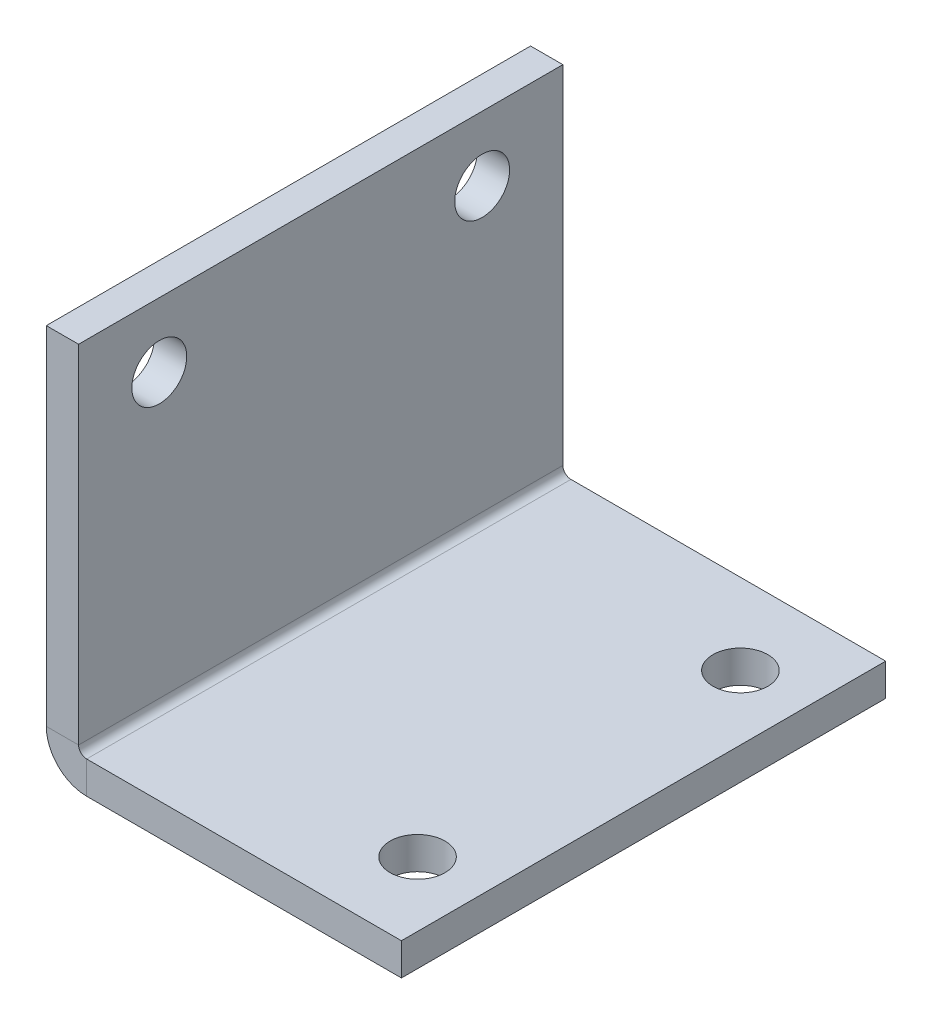
ISO-10303-21;
HEADER;
FILE_DESCRIPTION(('STEP AP214'),'2;1');
FILE_NAME('part.step','',(''),(''),'','','');
FILE_SCHEMA(('AUTOMOTIVE_DESIGN { 1 0 10303 214 1 1 1 1 }'));
ENDSEC;
DATA;
#1=APPLICATION_CONTEXT('core data for automotive mechanical design processes');
#2=APPLICATION_PROTOCOL_DEFINITION('international standard','automotive_design',2000,#1);
#3=PRODUCT_CONTEXT('',#1,'mechanical');
#4=PRODUCT('Part','Part','',(#3));
#5=PRODUCT_RELATED_PRODUCT_CATEGORY('part','',(#4));
#6=PRODUCT_DEFINITION_FORMATION('','',#4);
#7=PRODUCT_DEFINITION_CONTEXT('part definition',#1,'design');
#8=PRODUCT_DEFINITION('design','',#6,#7);
#9=PRODUCT_DEFINITION_SHAPE('','',#8);
#10=(LENGTH_UNIT() NAMED_UNIT(*) SI_UNIT(.MILLI.,.METRE.));
#11=(NAMED_UNIT(*) PLANE_ANGLE_UNIT() SI_UNIT($,.RADIAN.));
#12=(NAMED_UNIT(*) SI_UNIT($,.STERADIAN.) SOLID_ANGLE_UNIT());
#13=UNCERTAINTY_MEASURE_WITH_UNIT(LENGTH_MEASURE(1.E-05),#10,'distance_accuracy_value','');
#14=(GEOMETRIC_REPRESENTATION_CONTEXT(3) GLOBAL_UNCERTAINTY_ASSIGNED_CONTEXT((#13)) GLOBAL_UNIT_ASSIGNED_CONTEXT((#10,
#11,#12)) REPRESENTATION_CONTEXT('',''));
#15=CARTESIAN_POINT('',(0.,0.,0.));
#16=DIRECTION('',(0.,0.,1.));
#17=DIRECTION('',(1.,0.,0.));
#18=AXIS2_PLACEMENT_3D('',#15,#16,#17);
#19=CARTESIAN_POINT('',(0.5,0.,30.));
#20=DIRECTION('',(0.,0.,1.));
#21=DIRECTION('',(1.,0.,0.));
#22=AXIS2_PLACEMENT_3D('',#19,#20,#21);
#23=PLANE('',#22);
#24=DIRECTION('',(0.,-1.,0.));
#25=VECTOR('',#24,1.);
#26=CARTESIAN_POINT('',(0.5,0.,30.));
#27=LINE('',#26,#25);
#28=CARTESIAN_POINT('',(0.5,0.,30.));
#29=VERTEX_POINT('',#28);
#30=CARTESIAN_POINT('',(0.5,-2.,30.));
#31=VERTEX_POINT('',#30);
#32=EDGE_CURVE('E11',#29,#31,#27,.T.);
#33=ORIENTED_EDGE('',*,*,#32,.F.);
#34=CARTESIAN_POINT('',(0.5,0.5,30.));
#35=DIRECTION('',(0.,0.,-1.));
#36=DIRECTION('',(-1.,0.,0.));
#37=AXIS2_PLACEMENT_3D('',#34,#35,#36);
#38=CIRCLE('',#37,0.5);
#39=CARTESIAN_POINT('',(0.,0.5,30.));
#40=VERTEX_POINT('',#39);
#41=EDGE_CURVE('E139',#40,#29,#38,.F.);
#42=ORIENTED_EDGE('',*,*,#41,.F.);
#43=DIRECTION('',(1.,0.,0.));
#44=VECTOR('',#43,1.);
#45=CARTESIAN_POINT('',(-2.,0.5,30.));
#46=LINE('',#45,#44);
#47=CARTESIAN_POINT('',(-2.,0.5,30.));
#48=VERTEX_POINT('',#47);
#49=EDGE_CURVE('E49',#48,#40,#46,.T.);
#50=ORIENTED_EDGE('',*,*,#49,.F.);
#51=CARTESIAN_POINT('',(0.5,0.5,30.));
#52=DIRECTION('',(0.,0.,1.));
#53=DIRECTION('',(1.,0.,0.));
#54=AXIS2_PLACEMENT_3D('',#51,#52,#53);
#55=CIRCLE('',#54,2.5);
#56=EDGE_CURVE('E132',#48,#31,#55,.T.);
#57=ORIENTED_EDGE('',*,*,#56,.T.);
#58=EDGE_LOOP('',(#33,#42,#50,#57));
#59=FACE_BOUND('',#58,.T.);
#60=ADVANCED_FACE('F40',(#59),#23,.T.);
#61=CARTESIAN_POINT('',(-2.,0.5,30.));
#62=DIRECTION('',(0.,0.,1.));
#63=DIRECTION('',(1.,0.,0.));
#64=AXIS2_PLACEMENT_3D('',#61,#62,#63);
#65=PLANE('',#64);
#66=DIRECTION('',(1.,0.,0.));
#67=VECTOR('',#66,1.);
#68=CARTESIAN_POINT('',(0.,0.,30.));
#69=LINE('',#68,#67);
#70=CARTESIAN_POINT('',(20.,0.,30.));
#71=VERTEX_POINT('',#70);
#72=EDGE_CURVE('E200',#29,#71,#69,.T.);
#73=ORIENTED_EDGE('',*,*,#72,.F.);
#74=ORIENTED_EDGE('',*,*,#32,.T.);
#75=DIRECTION('',(1.,0.,0.));
#76=VECTOR('',#75,1.);
#77=CARTESIAN_POINT('',(0.,-2.,30.));
#78=LINE('',#77,#76);
#79=CARTESIAN_POINT('',(20.,-2.,30.));
#80=VERTEX_POINT('',#79);
#81=EDGE_CURVE('E98',#31,#80,#78,.T.);
#82=ORIENTED_EDGE('',*,*,#81,.T.);
#83=DIRECTION('',(0.,-1.,0.));
#84=VECTOR('',#83,1.);
#85=CARTESIAN_POINT('',(20.,0.,30.));
#86=LINE('',#85,#84);
#87=EDGE_CURVE('E197',#71,#80,#86,.T.);
#88=ORIENTED_EDGE('',*,*,#87,.F.);
#89=EDGE_LOOP('',(#73,#74,#82,#88));
#90=FACE_BOUND('',#89,.T.);
#91=ADVANCED_FACE('F220',(#90),#65,.T.);
#92=CARTESIAN_POINT('',(0.,0.5,0.));
#93=DIRECTION('',(0.,0.,-1.));
#94=DIRECTION('',(-1.,0.,0.));
#95=AXIS2_PLACEMENT_3D('',#92,#93,#94);
#96=PLANE('',#95);
#97=DIRECTION('',(-1.,0.,0.));
#98=VECTOR('',#97,1.);
#99=CARTESIAN_POINT('',(0.,0.5,0.));
#100=LINE('',#99,#98);
#101=CARTESIAN_POINT('',(0.,0.5,0.));
#102=VERTEX_POINT('',#101);
#103=CARTESIAN_POINT('',(-2.,0.5,0.));
#104=VERTEX_POINT('',#103);
#105=EDGE_CURVE('E85',#102,#104,#100,.T.);
#106=ORIENTED_EDGE('',*,*,#105,.F.);
#107=CARTESIAN_POINT('',(0.5,0.5,0.));
#108=DIRECTION('',(0.,0.,-1.));
#109=DIRECTION('',(-1.,0.,0.));
#110=AXIS2_PLACEMENT_3D('',#107,#108,#109);
#111=CIRCLE('',#110,0.5);
#112=CARTESIAN_POINT('',(0.5,0.,0.));
#113=VERTEX_POINT('',#112);
#114=EDGE_CURVE('E154',#102,#113,#111,.F.);
#115=ORIENTED_EDGE('',*,*,#114,.T.);
#116=DIRECTION('',(0.,1.,0.));
#117=VECTOR('',#116,1.);
#118=CARTESIAN_POINT('',(0.5,-2.,0.));
#119=LINE('',#118,#117);
#120=CARTESIAN_POINT('',(0.5,-2.,0.));
#121=VERTEX_POINT('',#120);
#122=EDGE_CURVE('E92',#121,#113,#119,.T.);
#123=ORIENTED_EDGE('',*,*,#122,.F.);
#124=CARTESIAN_POINT('',(0.5,0.5,0.));
#125=DIRECTION('',(0.,0.,1.));
#126=DIRECTION('',(1.,0.,0.));
#127=AXIS2_PLACEMENT_3D('',#124,#125,#126);
#128=CIRCLE('',#127,2.5);
#129=EDGE_CURVE('E161',#104,#121,#128,.T.);
#130=ORIENTED_EDGE('',*,*,#129,.F.);
#131=EDGE_LOOP('',(#106,#115,#123,#130));
#132=FACE_BOUND('',#131,.T.);
#133=ADVANCED_FACE('F218',(#132),#96,.T.);
#134=CARTESIAN_POINT('',(0.5,-2.,0.));
#135=DIRECTION('',(0.,0.,-1.));
#136=DIRECTION('',(-1.,0.,0.));
#137=AXIS2_PLACEMENT_3D('',#134,#135,#136);
#138=PLANE('',#137);
#139=DIRECTION('',(0.,-1.,0.));
#140=VECTOR('',#139,1.);
#141=CARTESIAN_POINT('',(0.,0.,0.));
#142=LINE('',#141,#140);
#143=CARTESIAN_POINT('',(0.,22.,0.));
#144=VERTEX_POINT('',#143);
#145=EDGE_CURVE('E156',#144,#102,#142,.T.);
#146=ORIENTED_EDGE('',*,*,#145,.T.);
#147=ORIENTED_EDGE('',*,*,#105,.T.);
#148=DIRECTION('',(0.,1.,0.));
#149=VECTOR('',#148,1.);
#150=CARTESIAN_POINT('',(-2.,0.,0.));
#151=LINE('',#150,#149);
#152=CARTESIAN_POINT('',(-2.,22.,0.));
#153=VERTEX_POINT('',#152);
#154=EDGE_CURVE('E159',#153,#104,#151,.F.);
#155=ORIENTED_EDGE('',*,*,#154,.F.);
#156=DIRECTION('',(1.,0.,0.));
#157=VECTOR('',#156,1.);
#158=CARTESIAN_POINT('',(-2.,22.,0.));
#159=LINE('',#158,#157);
#160=EDGE_CURVE('E120',#153,#144,#159,.T.);
#161=ORIENTED_EDGE('',*,*,#160,.T.);
#162=EDGE_LOOP('',(#146,#147,#155,#161));
#163=FACE_BOUND('',#162,.T.);
#164=ADVANCED_FACE('F214',(#163),#138,.T.);
#165=CARTESIAN_POINT('',(0.,-2.,30.));
#166=DIRECTION('',(0.,1.,0.));
#167=DIRECTION('',(0.,0.,1.));
#168=AXIS2_PLACEMENT_3D('',#165,#166,#167);
#169=PLANE('',#168);
#170=CARTESIAN_POINT('',(16.,-2.,5.));
#171=DIRECTION('',(0.,1.,0.));
#172=DIRECTION('',(0.,0.,1.));
#173=AXIS2_PLACEMENT_3D('',#170,#171,#172);
#174=CIRCLE('',#173,1.7);
#175=CARTESIAN_POINT('',(16.,-2.,6.7));
#176=VERTEX_POINT('',#175);
#177=EDGE_CURVE('E191',#176,#176,#174,.T.);
#178=ORIENTED_EDGE('',*,*,#177,.T.);
#179=EDGE_LOOP('',(#178));
#180=FACE_BOUND('',#179,.T.);
#181=CARTESIAN_POINT('',(16.,-2.,25.));
#182=DIRECTION('',(0.,1.,0.));
#183=DIRECTION('',(0.,0.,1.));
#184=AXIS2_PLACEMENT_3D('',#181,#182,#183);
#185=CIRCLE('',#184,1.7);
#186=CARTESIAN_POINT('',(16.,-2.,26.7));
#187=VERTEX_POINT('',#186);
#188=EDGE_CURVE('E457',#187,#187,#185,.T.);
#189=ORIENTED_EDGE('',*,*,#188,.T.);
#190=EDGE_LOOP('',(#189));
#191=FACE_BOUND('',#190,.T.);
#192=DIRECTION('',(1.,0.,0.));
#193=VECTOR('',#192,1.);
#194=CARTESIAN_POINT('',(0.,-2.,0.));
#195=LINE('',#194,#193);
#196=CARTESIAN_POINT('',(20.,-2.,0.));
#197=VERTEX_POINT('',#196);
#198=EDGE_CURVE('E145',#121,#197,#195,.T.);
#199=ORIENTED_EDGE('',*,*,#198,.T.);
#200=DIRECTION('',(0.,0.,-1.));
#201=VECTOR('',#200,1.);
#202=CARTESIAN_POINT('',(20.,-2.,30.));
#203=LINE('',#202,#201);
#204=EDGE_CURVE('E175',#80,#197,#203,.T.);
#205=ORIENTED_EDGE('',*,*,#204,.F.);
#206=ORIENTED_EDGE('',*,*,#81,.F.);
#207=DIRECTION('',(0.,0.,-1.));
#208=VECTOR('',#207,1.);
#209=CARTESIAN_POINT('',(0.5,-2.,30.));
#210=LINE('',#209,#208);
#211=EDGE_CURVE('E144',#31,#121,#210,.T.);
#212=ORIENTED_EDGE('',*,*,#211,.T.);
#213=EDGE_LOOP('',(#199,#205,#206,#212));
#214=FACE_BOUND('',#213,.T.);
#215=ADVANCED_FACE('F226',(#180,#191,#214),#169,.F.);
#216=CARTESIAN_POINT('',(20.,0.,30.));
#217=DIRECTION('',(1.,0.,0.));
#218=DIRECTION('',(0.,0.,-1.));
#219=AXIS2_PLACEMENT_3D('',#216,#217,#218);
#220=PLANE('',#219);
#221=DIRECTION('',(0.,-1.,0.));
#222=VECTOR('',#221,1.);
#223=CARTESIAN_POINT('',(20.,0.,0.));
#224=LINE('',#223,#222);
#225=CARTESIAN_POINT('',(20.,0.,0.));
#226=VERTEX_POINT('',#225);
#227=EDGE_CURVE('E148',#226,#197,#224,.T.);
#228=ORIENTED_EDGE('',*,*,#227,.F.);
#229=DIRECTION('',(0.,0.,-1.));
#230=VECTOR('',#229,1.);
#231=CARTESIAN_POINT('',(20.,0.,30.));
#232=LINE('',#231,#230);
#233=EDGE_CURVE('E173',#71,#226,#232,.T.);
#234=ORIENTED_EDGE('',*,*,#233,.F.);
#235=ORIENTED_EDGE('',*,*,#87,.T.);
#236=ORIENTED_EDGE('',*,*,#204,.T.);
#237=EDGE_LOOP('',(#228,#234,#235,#236));
#238=FACE_BOUND('',#237,.T.);
#239=ADVANCED_FACE('F255',(#238),#220,.T.);
#240=CARTESIAN_POINT('',(0.,0.,30.));
#241=DIRECTION('',(0.,1.,0.));
#242=DIRECTION('',(0.,0.,1.));
#243=AXIS2_PLACEMENT_3D('',#240,#241,#242);
#244=PLANE('',#243);
#245=CARTESIAN_POINT('',(16.,0.,5.));
#246=DIRECTION('',(0.,1.,0.));
#247=DIRECTION('',(0.,0.,1.));
#248=AXIS2_PLACEMENT_3D('',#245,#246,#247);
#249=CIRCLE('',#248,1.7);
#250=CARTESIAN_POINT('',(16.,0.,6.7));
#251=VERTEX_POINT('',#250);
#252=EDGE_CURVE('E454',#251,#251,#249,.T.);
#253=ORIENTED_EDGE('',*,*,#252,.F.);
#254=EDGE_LOOP('',(#253));
#255=FACE_BOUND('',#254,.T.);
#256=CARTESIAN_POINT('',(16.,0.,25.));
#257=DIRECTION('',(0.,1.,0.));
#258=DIRECTION('',(0.,0.,1.));
#259=AXIS2_PLACEMENT_3D('',#256,#257,#258);
#260=CIRCLE('',#259,1.7);
#261=CARTESIAN_POINT('',(16.,0.,26.7));
#262=VERTEX_POINT('',#261);
#263=EDGE_CURVE('E461',#262,#262,#260,.T.);
#264=ORIENTED_EDGE('',*,*,#263,.F.);
#265=EDGE_LOOP('',(#264));
#266=FACE_BOUND('',#265,.T.);
#267=DIRECTION('',(1.,0.,0.));
#268=VECTOR('',#267,1.);
#269=CARTESIAN_POINT('',(0.,0.,0.));
#270=LINE('',#269,#268);
#271=EDGE_CURVE('E151',#113,#226,#270,.T.);
#272=ORIENTED_EDGE('',*,*,#271,.F.);
#273=DIRECTION('',(0.,0.,-1.));
#274=VECTOR('',#273,1.);
#275=CARTESIAN_POINT('',(0.5,0.,30.));
#276=LINE('',#275,#274);
#277=EDGE_CURVE('E170',#29,#113,#276,.T.);
#278=ORIENTED_EDGE('',*,*,#277,.F.);
#279=ORIENTED_EDGE('',*,*,#72,.T.);
#280=ORIENTED_EDGE('',*,*,#233,.T.);
#281=EDGE_LOOP('',(#272,#278,#279,#280));
#282=FACE_BOUND('',#281,.T.);
#283=ADVANCED_FACE('F260',(#255,#266,#282),#244,.T.);
#284=CARTESIAN_POINT('',(0.5,0.5,30.));
#285=DIRECTION('',(0.,0.,-1.));
#286=DIRECTION('',(-1.,0.,0.));
#287=AXIS2_PLACEMENT_3D('',#284,#285,#286);
#288=CYLINDRICAL_SURFACE('',#287,0.5);
#289=ORIENTED_EDGE('',*,*,#114,.F.);
#290=DIRECTION('',(0.,0.,-1.));
#291=VECTOR('',#290,1.);
#292=CARTESIAN_POINT('',(0.,0.5,30.));
#293=LINE('',#292,#291);
#294=EDGE_CURVE('E167',#40,#102,#293,.T.);
#295=ORIENTED_EDGE('',*,*,#294,.F.);
#296=ORIENTED_EDGE('',*,*,#41,.T.);
#297=ORIENTED_EDGE('',*,*,#277,.T.);
#298=EDGE_LOOP('',(#289,#295,#296,#297));
#299=FACE_BOUND('',#298,.T.);
#300=ADVANCED_FACE('F207',(#299),#288,.F.);
#301=CARTESIAN_POINT('',(0.,0.,30.));
#302=DIRECTION('',(1.,0.,0.));
#303=DIRECTION('',(0.,0.,-1.));
#304=AXIS2_PLACEMENT_3D('',#301,#302,#303);
#305=PLANE('',#304);
#306=CARTESIAN_POINT('',(0.,18.,25.));
#307=DIRECTION('',(1.,0.,0.));
#308=DIRECTION('',(0.,0.,-1.));
#309=AXIS2_PLACEMENT_3D('',#306,#307,#308);
#310=CIRCLE('',#309,1.7);
#311=CARTESIAN_POINT('',(0.,18.,23.3));
#312=VERTEX_POINT('',#311);
#313=EDGE_CURVE('E181',#312,#312,#310,.T.);
#314=ORIENTED_EDGE('',*,*,#313,.F.);
#315=EDGE_LOOP('',(#314));
#316=FACE_BOUND('',#315,.T.);
#317=CARTESIAN_POINT('',(0.,18.,5.));
#318=DIRECTION('',(1.,0.,0.));
#319=DIRECTION('',(0.,0.,-1.));
#320=AXIS2_PLACEMENT_3D('',#317,#318,#319);
#321=CIRCLE('',#320,1.7);
#322=CARTESIAN_POINT('',(0.,18.,3.3));
#323=VERTEX_POINT('',#322);
#324=EDGE_CURVE('E186',#323,#323,#321,.T.);
#325=ORIENTED_EDGE('',*,*,#324,.F.);
#326=EDGE_LOOP('',(#325));
#327=FACE_BOUND('',#326,.T.);
#328=ORIENTED_EDGE('',*,*,#145,.F.);
#329=DIRECTION('',(0.,0.,-1.));
#330=VECTOR('',#329,1.);
#331=CARTESIAN_POINT('',(0.,22.,30.));
#332=LINE('',#331,#330);
#333=CARTESIAN_POINT('',(0.,22.,30.));
#334=VERTEX_POINT('',#333);
#335=EDGE_CURVE('E122',#334,#144,#332,.T.);
#336=ORIENTED_EDGE('',*,*,#335,.F.);
#337=DIRECTION('',(0.,-1.,0.));
#338=VECTOR('',#337,1.);
#339=CARTESIAN_POINT('',(0.,0.,30.));
#340=LINE('',#339,#338);
#341=EDGE_CURVE('E137',#334,#40,#340,.T.);
#342=ORIENTED_EDGE('',*,*,#341,.T.);
#343=ORIENTED_EDGE('',*,*,#294,.T.);
#344=EDGE_LOOP('',(#328,#336,#342,#343));
#345=FACE_BOUND('',#344,.T.);
#346=ADVANCED_FACE('F213',(#316,#327,#345),#305,.T.);
#347=CARTESIAN_POINT('',(-2.,22.,30.));
#348=DIRECTION('',(0.,1.,0.));
#349=DIRECTION('',(0.,0.,1.));
#350=AXIS2_PLACEMENT_3D('',#347,#348,#349);
#351=PLANE('',#350);
#352=ORIENTED_EDGE('',*,*,#160,.F.);
#353=DIRECTION('',(0.,0.,-1.));
#354=VECTOR('',#353,1.);
#355=CARTESIAN_POINT('',(-2.,22.,30.));
#356=LINE('',#355,#354);
#357=CARTESIAN_POINT('',(-2.,22.,30.));
#358=VERTEX_POINT('',#357);
#359=EDGE_CURVE('E114',#358,#153,#356,.T.);
#360=ORIENTED_EDGE('',*,*,#359,.F.);
#361=DIRECTION('',(1.,0.,0.));
#362=VECTOR('',#361,1.);
#363=CARTESIAN_POINT('',(-2.,22.,30.));
#364=LINE('',#363,#362);
#365=EDGE_CURVE('E118',#358,#334,#364,.T.);
#366=ORIENTED_EDGE('',*,*,#365,.T.);
#367=ORIENTED_EDGE('',*,*,#335,.T.);
#368=EDGE_LOOP('',(#352,#360,#366,#367));
#369=FACE_BOUND('',#368,.T.);
#370=ADVANCED_FACE('F116',(#369),#351,.T.);
#371=CARTESIAN_POINT('',(-2.,0.,30.));
#372=DIRECTION('',(1.,0.,0.));
#373=DIRECTION('',(0.,0.,-1.));
#374=AXIS2_PLACEMENT_3D('',#371,#372,#373);
#375=PLANE('',#374);
#376=CARTESIAN_POINT('',(-2.,18.,25.));
#377=DIRECTION('',(1.,0.,0.));
#378=DIRECTION('',(0.,0.,-1.));
#379=AXIS2_PLACEMENT_3D('',#376,#377,#378);
#380=CIRCLE('',#379,1.7);
#381=CARTESIAN_POINT('',(-2.,18.,23.3));
#382=VERTEX_POINT('',#381);
#383=EDGE_CURVE('E43',#382,#382,#380,.T.);
#384=ORIENTED_EDGE('',*,*,#383,.T.);
#385=EDGE_LOOP('',(#384));
#386=FACE_BOUND('',#385,.T.);
#387=CARTESIAN_POINT('',(-2.,18.,5.));
#388=DIRECTION('',(1.,0.,0.));
#389=DIRECTION('',(0.,0.,-1.));
#390=AXIS2_PLACEMENT_3D('',#387,#388,#389);
#391=CIRCLE('',#390,1.7);
#392=CARTESIAN_POINT('',(-2.,18.,3.3));
#393=VERTEX_POINT('',#392);
#394=EDGE_CURVE('E179',#393,#393,#391,.T.);
#395=ORIENTED_EDGE('',*,*,#394,.T.);
#396=EDGE_LOOP('',(#395));
#397=FACE_BOUND('',#396,.T.);
#398=ORIENTED_EDGE('',*,*,#154,.T.);
#399=DIRECTION('',(0.,0.,-1.));
#400=VECTOR('',#399,1.);
#401=CARTESIAN_POINT('',(-2.,0.5,30.));
#402=LINE('',#401,#400);
#403=EDGE_CURVE('E123',#48,#104,#402,.T.);
#404=ORIENTED_EDGE('',*,*,#403,.F.);
#405=DIRECTION('',(0.,1.,0.));
#406=VECTOR('',#405,1.);
#407=CARTESIAN_POINT('',(-2.,0.,30.));
#408=LINE('',#407,#406);
#409=EDGE_CURVE('E127',#358,#48,#408,.F.);
#410=ORIENTED_EDGE('',*,*,#409,.F.);
#411=ORIENTED_EDGE('',*,*,#359,.T.);
#412=EDGE_LOOP('',(#398,#404,#410,#411));
#413=FACE_BOUND('',#412,.T.);
#414=ADVANCED_FACE('F128',(#386,#397,#413),#375,.F.);
#415=CARTESIAN_POINT('',(0.5,0.5,30.));
#416=DIRECTION('',(0.,0.,-1.));
#417=DIRECTION('',(-1.,0.,0.));
#418=AXIS2_PLACEMENT_3D('',#415,#416,#417);
#419=CYLINDRICAL_SURFACE('',#418,2.5);
#420=ORIENTED_EDGE('',*,*,#129,.T.);
#421=ORIENTED_EDGE('',*,*,#211,.F.);
#422=ORIENTED_EDGE('',*,*,#56,.F.);
#423=ORIENTED_EDGE('',*,*,#403,.T.);
#424=EDGE_LOOP('',(#420,#421,#422,#423));
#425=FACE_BOUND('',#424,.T.);
#426=ADVANCED_FACE('F216',(#425),#419,.T.);
#427=CARTESIAN_POINT('',(0.5,0.5,30.));
#428=DIRECTION('',(0.,0.,-1.));
#429=DIRECTION('',(-1.,0.,0.));
#430=AXIS2_PLACEMENT_3D('',#427,#428,#429);
#431=PLANE('',#430);
#432=ORIENTED_EDGE('',*,*,#409,.T.);
#433=ORIENTED_EDGE('',*,*,#49,.T.);
#434=ORIENTED_EDGE('',*,*,#341,.F.);
#435=ORIENTED_EDGE('',*,*,#365,.F.);
#436=EDGE_LOOP('',(#432,#433,#434,#435));
#437=FACE_BOUND('',#436,.T.);
#438=ADVANCED_FACE('F135',(#437),#431,.F.);
#439=CARTESIAN_POINT('',(0.5,0.5,0.));
#440=DIRECTION('',(0.,0.,-1.));
#441=DIRECTION('',(-1.,0.,0.));
#442=AXIS2_PLACEMENT_3D('',#439,#440,#441);
#443=PLANE('',#442);
#444=ORIENTED_EDGE('',*,*,#198,.F.);
#445=ORIENTED_EDGE('',*,*,#122,.T.);
#446=ORIENTED_EDGE('',*,*,#271,.T.);
#447=ORIENTED_EDGE('',*,*,#227,.T.);
#448=EDGE_LOOP('',(#444,#445,#446,#447));
#449=FACE_BOUND('',#448,.T.);
#450=ADVANCED_FACE('F304',(#449),#443,.T.);
#451=CARTESIAN_POINT('',(-10.,18.,5.));
#452=DIRECTION('',(1.,0.,0.));
#453=DIRECTION('',(0.,0.,-1.));
#454=AXIS2_PLACEMENT_3D('',#451,#452,#453);
#455=CYLINDRICAL_SURFACE('',#454,1.7);
#456=ORIENTED_EDGE('',*,*,#324,.T.);
#457=EDGE_LOOP('',(#456));
#458=FACE_BOUND('',#457,.T.);
#459=ORIENTED_EDGE('',*,*,#394,.F.);
#460=EDGE_LOOP('',(#459));
#461=FACE_BOUND('',#460,.T.);
#462=ADVANCED_FACE('F314',(#458,#461),#455,.F.);
#463=CARTESIAN_POINT('',(-10.,18.,25.));
#464=DIRECTION('',(1.,0.,0.));
#465=DIRECTION('',(0.,0.,-1.));
#466=AXIS2_PLACEMENT_3D('',#463,#464,#465);
#467=CYLINDRICAL_SURFACE('',#466,1.7);
#468=ORIENTED_EDGE('',*,*,#313,.T.);
#469=EDGE_LOOP('',(#468));
#470=FACE_BOUND('',#469,.T.);
#471=ORIENTED_EDGE('',*,*,#383,.F.);
#472=EDGE_LOOP('',(#471));
#473=FACE_BOUND('',#472,.T.);
#474=ADVANCED_FACE('F341',(#470,#473),#467,.F.);
#475=CARTESIAN_POINT('',(16.,-10.,25.));
#476=DIRECTION('',(0.,1.,0.));
#477=DIRECTION('',(0.,0.,1.));
#478=AXIS2_PLACEMENT_3D('',#475,#476,#477);
#479=CYLINDRICAL_SURFACE('',#478,1.7);
#480=ORIENTED_EDGE('',*,*,#263,.T.);
#481=EDGE_LOOP('',(#480));
#482=FACE_BOUND('',#481,.T.);
#483=ORIENTED_EDGE('',*,*,#188,.F.);
#484=EDGE_LOOP('',(#483));
#485=FACE_BOUND('',#484,.T.);
#486=ADVANCED_FACE('F352',(#482,#485),#479,.F.);
#487=CARTESIAN_POINT('',(16.,-10.,5.));
#488=DIRECTION('',(0.,1.,0.));
#489=DIRECTION('',(0.,0.,1.));
#490=AXIS2_PLACEMENT_3D('',#487,#488,#489);
#491=CYLINDRICAL_SURFACE('',#490,1.7);
#492=ORIENTED_EDGE('',*,*,#252,.T.);
#493=EDGE_LOOP('',(#492));
#494=FACE_BOUND('',#493,.T.);
#495=ORIENTED_EDGE('',*,*,#177,.F.);
#496=EDGE_LOOP('',(#495));
#497=FACE_BOUND('',#496,.T.);
#498=ADVANCED_FACE('F378',(#494,#497),#491,.F.);
#499=CLOSED_SHELL('',(#60,#91,#133,#164,#215,#239,#283,#300,#346,#370,#414,#426,#438,#450,#462,
#474,#486,#498));
#500=MANIFOLD_SOLID_BREP('B2',#499);
#501=ADVANCED_BREP_SHAPE_REPRESENTATION('',(#18,#500),#14);
#502=SHAPE_DEFINITION_REPRESENTATION(#9,#501);
ENDSEC;
END-ISO-10303-21;
